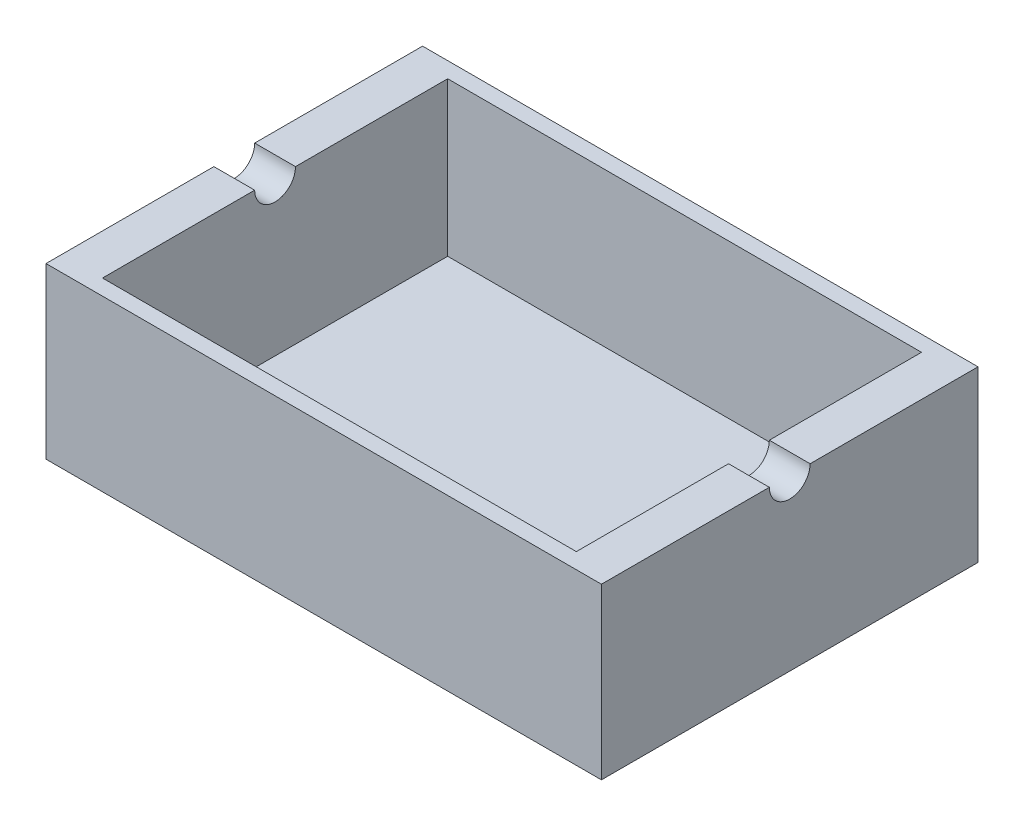
ISO-10303-21;
HEADER;
FILE_DESCRIPTION(('STEP AP214'),'2;1');
FILE_NAME('part.step','',(''),(''),'','','');
FILE_SCHEMA(('AUTOMOTIVE_DESIGN { 1 0 10303 214 1 1 1 1 }'));
ENDSEC;
DATA;
#1=APPLICATION_CONTEXT('core data for automotive mechanical design processes');
#2=APPLICATION_PROTOCOL_DEFINITION('international standard','automotive_design',2000,#1);
#3=PRODUCT_CONTEXT('',#1,'mechanical');
#4=PRODUCT('Part','Part','',(#3));
#5=PRODUCT_RELATED_PRODUCT_CATEGORY('part','',(#4));
#6=PRODUCT_DEFINITION_FORMATION('','',#4);
#7=PRODUCT_DEFINITION_CONTEXT('part definition',#1,'design');
#8=PRODUCT_DEFINITION('design','',#6,#7);
#9=PRODUCT_DEFINITION_SHAPE('','',#8);
#10=(LENGTH_UNIT() NAMED_UNIT(*) SI_UNIT(.MILLI.,.METRE.));
#11=(NAMED_UNIT(*) PLANE_ANGLE_UNIT() SI_UNIT($,.RADIAN.));
#12=(NAMED_UNIT(*) SI_UNIT($,.STERADIAN.) SOLID_ANGLE_UNIT());
#13=UNCERTAINTY_MEASURE_WITH_UNIT(LENGTH_MEASURE(1.E-05),#10,'distance_accuracy_value','');
#14=(GEOMETRIC_REPRESENTATION_CONTEXT(3) GLOBAL_UNCERTAINTY_ASSIGNED_CONTEXT((#13)) GLOBAL_UNIT_ASSIGNED_CONTEXT((#10,
#11,#12)) REPRESENTATION_CONTEXT('',''));
#15=CARTESIAN_POINT('',(0.,0.,0.));
#16=DIRECTION('',(0.,0.,1.));
#17=DIRECTION('',(1.,0.,0.));
#18=AXIS2_PLACEMENT_3D('',#15,#16,#17);
#19=CARTESIAN_POINT('',(0.,19.6,0.));
#20=DIRECTION('',(0.,-1.,0.));
#21=DIRECTION('',(0.,0.,-1.));
#22=AXIS2_PLACEMENT_3D('',#19,#20,#21);
#23=PLANE('',#22);
#24=DIRECTION('',(0.,0.,1.));
#25=VECTOR('',#24,1.);
#26=CARTESIAN_POINT('',(-35.4,19.6,24.));
#27=LINE('',#26,#25);
#28=CARTESIAN_POINT('',(-35.4,19.6,-24.));
#29=VERTEX_POINT('',#28);
#30=CARTESIAN_POINT('',(-35.4,19.6,-2.6));
#31=VERTEX_POINT('',#30);
#32=EDGE_CURVE('E150',#29,#31,#27,.T.);
#33=ORIENTED_EDGE('',*,*,#32,.T.);
#34=DIRECTION('',(1.,0.,0.));
#35=VECTOR('',#34,1.);
#36=CARTESIAN_POINT('',(-41.2137767414995,19.6,-2.6));
#37=LINE('',#36,#35);
#38=CARTESIAN_POINT('',(-30.2,19.6,-2.6));
#39=VERTEX_POINT('',#38);
#40=EDGE_CURVE('E135',#31,#39,#37,.T.);
#41=ORIENTED_EDGE('',*,*,#40,.T.);
#42=DIRECTION('',(0.,0.,1.));
#43=VECTOR('',#42,1.);
#44=CARTESIAN_POINT('',(-30.2,19.6,22.));
#45=LINE('',#44,#43);
#46=CARTESIAN_POINT('',(-30.2,19.6,-22.));
#47=VERTEX_POINT('',#46);
#48=EDGE_CURVE('E190',#47,#39,#45,.T.);
#49=ORIENTED_EDGE('',*,*,#48,.F.);
#50=DIRECTION('',(-1.,0.,0.));
#51=VECTOR('',#50,1.);
#52=CARTESIAN_POINT('',(-30.2,19.6,-22.));
#53=LINE('',#52,#51);
#54=CARTESIAN_POINT('',(30.2,19.6,-22.));
#55=VERTEX_POINT('',#54);
#56=EDGE_CURVE('E187',#55,#47,#53,.T.);
#57=ORIENTED_EDGE('',*,*,#56,.F.);
#58=DIRECTION('',(0.,0.,-1.));
#59=VECTOR('',#58,1.);
#60=CARTESIAN_POINT('',(30.2,19.6,22.));
#61=LINE('',#60,#59);
#62=CARTESIAN_POINT('',(30.2,19.6,-2.6));
#63=VERTEX_POINT('',#62);
#64=EDGE_CURVE('E134',#63,#55,#61,.T.);
#65=ORIENTED_EDGE('',*,*,#64,.F.);
#66=CARTESIAN_POINT('',(35.4,19.6,-2.6));
#67=VERTEX_POINT('',#66);
#68=EDGE_CURVE('E48',#63,#67,#37,.T.);
#69=ORIENTED_EDGE('',*,*,#68,.T.);
#70=DIRECTION('',(0.,0.,-1.));
#71=VECTOR('',#70,1.);
#72=CARTESIAN_POINT('',(35.4,19.6,24.));
#73=LINE('',#72,#71);
#74=CARTESIAN_POINT('',(35.4,19.6,-24.));
#75=VERTEX_POINT('',#74);
#76=EDGE_CURVE('E131',#67,#75,#73,.T.);
#77=ORIENTED_EDGE('',*,*,#76,.T.);
#78=DIRECTION('',(-1.,0.,0.));
#79=VECTOR('',#78,1.);
#80=CARTESIAN_POINT('',(-35.4,19.6,-24.));
#81=LINE('',#80,#79);
#82=EDGE_CURVE('E142',#75,#29,#81,.T.);
#83=ORIENTED_EDGE('',*,*,#82,.T.);
#84=EDGE_LOOP('',(#33,#41,#49,#57,#65,#69,#77,#83));
#85=FACE_BOUND('',#84,.T.);
#86=ADVANCED_FACE('F33',(#85),#23,.F.);
#87=CARTESIAN_POINT('',(35.4,19.6,24.));
#88=VERTEX_POINT('',#87);
#89=CARTESIAN_POINT('',(35.4,19.6,2.6));
#90=VERTEX_POINT('',#89);
#91=EDGE_CURVE('E139',#88,#90,#73,.T.);
#92=ORIENTED_EDGE('',*,*,#91,.T.);
#93=DIRECTION('',(1.,0.,0.));
#94=VECTOR('',#93,1.);
#95=CARTESIAN_POINT('',(-41.2137767414995,19.6,2.6));
#96=LINE('',#95,#94);
#97=CARTESIAN_POINT('',(30.2,19.6,2.6));
#98=VERTEX_POINT('',#97);
#99=EDGE_CURVE('E122',#98,#90,#96,.T.);
#100=ORIENTED_EDGE('',*,*,#99,.F.);
#101=CARTESIAN_POINT('',(30.2,19.6,22.));
#102=VERTEX_POINT('',#101);
#103=EDGE_CURVE('E184',#102,#98,#61,.T.);
#104=ORIENTED_EDGE('',*,*,#103,.F.);
#105=DIRECTION('',(1.,0.,0.));
#106=VECTOR('',#105,1.);
#107=CARTESIAN_POINT('',(-30.2,19.6,22.));
#108=LINE('',#107,#106);
#109=CARTESIAN_POINT('',(-30.2,19.6,22.));
#110=VERTEX_POINT('',#109);
#111=EDGE_CURVE('E193',#110,#102,#108,.T.);
#112=ORIENTED_EDGE('',*,*,#111,.F.);
#113=CARTESIAN_POINT('',(-30.2,19.6,2.6));
#114=VERTEX_POINT('',#113);
#115=EDGE_CURVE('E189',#114,#110,#45,.T.);
#116=ORIENTED_EDGE('',*,*,#115,.F.);
#117=CARTESIAN_POINT('',(-35.4,19.6,2.6));
#118=VERTEX_POINT('',#117);
#119=EDGE_CURVE('E55',#118,#114,#96,.T.);
#120=ORIENTED_EDGE('',*,*,#119,.F.);
#121=CARTESIAN_POINT('',(-35.4,19.6,24.));
#122=VERTEX_POINT('',#121);
#123=EDGE_CURVE('E149',#118,#122,#27,.T.);
#124=ORIENTED_EDGE('',*,*,#123,.T.);
#125=DIRECTION('',(1.,0.,0.));
#126=VECTOR('',#125,1.);
#127=CARTESIAN_POINT('',(-35.4,19.6,24.));
#128=LINE('',#127,#126);
#129=EDGE_CURVE('E152',#122,#88,#128,.T.);
#130=ORIENTED_EDGE('',*,*,#129,.T.);
#131=EDGE_LOOP('',(#92,#100,#104,#112,#116,#120,#124,#130));
#132=FACE_BOUND('',#131,.T.);
#133=ADVANCED_FACE('F231',(#132),#23,.F.);
#134=CARTESIAN_POINT('',(35.4,19.6,24.));
#135=DIRECTION('',(-1.,0.,0.));
#136=DIRECTION('',(0.,0.,1.));
#137=AXIS2_PLACEMENT_3D('',#134,#135,#136);
#138=PLANE('',#137);
#139=ORIENTED_EDGE('',*,*,#76,.F.);
#140=CARTESIAN_POINT('',(35.4,19.6,0.));
#141=DIRECTION('',(1.,0.,0.));
#142=DIRECTION('',(0.,0.,-1.));
#143=AXIS2_PLACEMENT_3D('',#140,#141,#142);
#144=CIRCLE('',#143,2.6);
#145=EDGE_CURVE('E119',#90,#67,#144,.T.);
#146=ORIENTED_EDGE('',*,*,#145,.F.);
#147=ORIENTED_EDGE('',*,*,#91,.F.);
#148=DIRECTION('',(0.,-1.,0.));
#149=VECTOR('',#148,1.);
#150=CARTESIAN_POINT('',(35.4,19.6,24.));
#151=LINE('',#150,#149);
#152=CARTESIAN_POINT('',(35.4,-2.,24.));
#153=VERTEX_POINT('',#152);
#154=EDGE_CURVE('E154',#88,#153,#151,.T.);
#155=ORIENTED_EDGE('',*,*,#154,.T.);
#156=DIRECTION('',(0.,0.,-1.));
#157=VECTOR('',#156,1.);
#158=CARTESIAN_POINT('',(35.4,-2.,0.));
#159=LINE('',#158,#157);
#160=CARTESIAN_POINT('',(35.4,-2.,-24.));
#161=VERTEX_POINT('',#160);
#162=EDGE_CURVE('E170',#153,#161,#159,.T.);
#163=ORIENTED_EDGE('',*,*,#162,.T.);
#164=DIRECTION('',(0.,-1.,0.));
#165=VECTOR('',#164,1.);
#166=CARTESIAN_POINT('',(35.4,19.6,-24.));
#167=LINE('',#166,#165);
#168=EDGE_CURVE('E41',#75,#161,#167,.T.);
#169=ORIENTED_EDGE('',*,*,#168,.F.);
#170=EDGE_LOOP('',(#139,#146,#147,#155,#163,#169));
#171=FACE_BOUND('',#170,.T.);
#172=ADVANCED_FACE('F35',(#171),#138,.F.);
#173=CARTESIAN_POINT('',(-35.4,19.6,-24.));
#174=DIRECTION('',(0.,0.,1.));
#175=DIRECTION('',(1.,0.,0.));
#176=AXIS2_PLACEMENT_3D('',#173,#174,#175);
#177=PLANE('',#176);
#178=ORIENTED_EDGE('',*,*,#168,.T.);
#179=DIRECTION('',(1.,0.,0.));
#180=VECTOR('',#179,1.);
#181=CARTESIAN_POINT('',(0.,-2.,-24.));
#182=LINE('',#181,#180);
#183=CARTESIAN_POINT('',(-35.4,-2.,-24.));
#184=VERTEX_POINT('',#183);
#185=EDGE_CURVE('E164',#184,#161,#182,.T.);
#186=ORIENTED_EDGE('',*,*,#185,.F.);
#187=DIRECTION('',(0.,-1.,0.));
#188=VECTOR('',#187,1.);
#189=CARTESIAN_POINT('',(-35.4,19.6,-24.));
#190=LINE('',#189,#188);
#191=EDGE_CURVE('E158',#29,#184,#190,.T.);
#192=ORIENTED_EDGE('',*,*,#191,.F.);
#193=ORIENTED_EDGE('',*,*,#82,.F.);
#194=EDGE_LOOP('',(#178,#186,#192,#193));
#195=FACE_BOUND('',#194,.T.);
#196=ADVANCED_FACE('F162',(#195),#177,.F.);
#197=CARTESIAN_POINT('',(-35.4,19.6,24.));
#198=DIRECTION('',(1.,0.,0.));
#199=DIRECTION('',(0.,0.,-1.));
#200=AXIS2_PLACEMENT_3D('',#197,#198,#199);
#201=PLANE('',#200);
#202=ORIENTED_EDGE('',*,*,#123,.F.);
#203=CARTESIAN_POINT('',(-35.4,19.6,0.));
#204=DIRECTION('',(1.,0.,0.));
#205=DIRECTION('',(0.,0.,-1.));
#206=AXIS2_PLACEMENT_3D('',#203,#204,#205);
#207=CIRCLE('',#206,2.6);
#208=EDGE_CURVE('E232',#31,#118,#207,.F.);
#209=ORIENTED_EDGE('',*,*,#208,.F.);
#210=ORIENTED_EDGE('',*,*,#32,.F.);
#211=ORIENTED_EDGE('',*,*,#191,.T.);
#212=DIRECTION('',(0.,0.,-1.));
#213=VECTOR('',#212,1.);
#214=CARTESIAN_POINT('',(-35.4,-2.,0.));
#215=LINE('',#214,#213);
#216=CARTESIAN_POINT('',(-35.4,-2.,24.));
#217=VERTEX_POINT('',#216);
#218=EDGE_CURVE('E173',#217,#184,#215,.T.);
#219=ORIENTED_EDGE('',*,*,#218,.F.);
#220=DIRECTION('',(0.,-1.,0.));
#221=VECTOR('',#220,1.);
#222=CARTESIAN_POINT('',(-35.4,19.6,24.));
#223=LINE('',#222,#221);
#224=EDGE_CURVE('E156',#122,#217,#223,.T.);
#225=ORIENTED_EDGE('',*,*,#224,.F.);
#226=EDGE_LOOP('',(#202,#209,#210,#211,#219,#225));
#227=FACE_BOUND('',#226,.T.);
#228=ADVANCED_FACE('F257',(#227),#201,.F.);
#229=CARTESIAN_POINT('',(-35.4,19.6,24.));
#230=DIRECTION('',(0.,0.,-1.));
#231=DIRECTION('',(-1.,0.,0.));
#232=AXIS2_PLACEMENT_3D('',#229,#230,#231);
#233=PLANE('',#232);
#234=ORIENTED_EDGE('',*,*,#224,.T.);
#235=DIRECTION('',(1.,0.,0.));
#236=VECTOR('',#235,1.);
#237=CARTESIAN_POINT('',(0.,-2.,24.));
#238=LINE('',#237,#236);
#239=EDGE_CURVE('E176',#217,#153,#238,.T.);
#240=ORIENTED_EDGE('',*,*,#239,.T.);
#241=ORIENTED_EDGE('',*,*,#154,.F.);
#242=ORIENTED_EDGE('',*,*,#129,.F.);
#243=EDGE_LOOP('',(#234,#240,#241,#242));
#244=FACE_BOUND('',#243,.T.);
#245=ADVANCED_FACE('F254',(#244),#233,.F.);
#246=CARTESIAN_POINT('',(30.2,19.6,22.));
#247=DIRECTION('',(-1.,0.,0.));
#248=DIRECTION('',(0.,0.,1.));
#249=AXIS2_PLACEMENT_3D('',#246,#247,#248);
#250=PLANE('',#249);
#251=CARTESIAN_POINT('',(30.2,19.6,0.));
#252=DIRECTION('',(-1.,0.,0.));
#253=DIRECTION('',(0.,0.,1.));
#254=AXIS2_PLACEMENT_3D('',#251,#252,#253);
#255=CIRCLE('',#254,2.6);
#256=EDGE_CURVE('E178',#63,#98,#255,.T.);
#257=ORIENTED_EDGE('',*,*,#256,.F.);
#258=ORIENTED_EDGE('',*,*,#64,.T.);
#259=DIRECTION('',(0.,-1.,0.));
#260=VECTOR('',#259,1.);
#261=CARTESIAN_POINT('',(30.2,19.6,-22.));
#262=LINE('',#261,#260);
#263=CARTESIAN_POINT('',(30.2,0.,-22.));
#264=VERTEX_POINT('',#263);
#265=EDGE_CURVE('E140',#55,#264,#262,.T.);
#266=ORIENTED_EDGE('',*,*,#265,.T.);
#267=DIRECTION('',(0.,0.,-1.));
#268=VECTOR('',#267,1.);
#269=CARTESIAN_POINT('',(30.2,0.,22.));
#270=LINE('',#269,#268);
#271=CARTESIAN_POINT('',(30.2,0.,22.));
#272=VERTEX_POINT('',#271);
#273=EDGE_CURVE('E183',#272,#264,#270,.T.);
#274=ORIENTED_EDGE('',*,*,#273,.F.);
#275=DIRECTION('',(0.,-1.,0.));
#276=VECTOR('',#275,1.);
#277=CARTESIAN_POINT('',(30.2,19.6,22.));
#278=LINE('',#277,#276);
#279=EDGE_CURVE('E195',#102,#272,#278,.T.);
#280=ORIENTED_EDGE('',*,*,#279,.F.);
#281=ORIENTED_EDGE('',*,*,#103,.T.);
#282=EDGE_LOOP('',(#257,#258,#266,#274,#280,#281));
#283=FACE_BOUND('',#282,.T.);
#284=ADVANCED_FACE('F224',(#283),#250,.T.);
#285=CARTESIAN_POINT('',(-30.2,19.6,-22.));
#286=DIRECTION('',(0.,0.,1.));
#287=DIRECTION('',(1.,0.,0.));
#288=AXIS2_PLACEMENT_3D('',#285,#286,#287);
#289=PLANE('',#288);
#290=DIRECTION('',(-1.,0.,0.));
#291=VECTOR('',#290,1.);
#292=CARTESIAN_POINT('',(-30.2,0.,-22.));
#293=LINE('',#292,#291);
#294=CARTESIAN_POINT('',(-30.2,0.,-22.));
#295=VERTEX_POINT('',#294);
#296=EDGE_CURVE('E198',#264,#295,#293,.T.);
#297=ORIENTED_EDGE('',*,*,#296,.F.);
#298=ORIENTED_EDGE('',*,*,#265,.F.);
#299=ORIENTED_EDGE('',*,*,#56,.T.);
#300=DIRECTION('',(0.,-1.,0.));
#301=VECTOR('',#300,1.);
#302=CARTESIAN_POINT('',(-30.2,19.6,-22.));
#303=LINE('',#302,#301);
#304=EDGE_CURVE('E144',#47,#295,#303,.T.);
#305=ORIENTED_EDGE('',*,*,#304,.T.);
#306=EDGE_LOOP('',(#297,#298,#299,#305));
#307=FACE_BOUND('',#306,.T.);
#308=ADVANCED_FACE('F214',(#307),#289,.T.);
#309=CARTESIAN_POINT('',(-30.2,19.6,22.));
#310=DIRECTION('',(1.,0.,0.));
#311=DIRECTION('',(0.,0.,-1.));
#312=AXIS2_PLACEMENT_3D('',#309,#310,#311);
#313=PLANE('',#312);
#314=CARTESIAN_POINT('',(-30.2,19.6,0.));
#315=DIRECTION('',(1.,0.,0.));
#316=DIRECTION('',(0.,0.,-1.));
#317=AXIS2_PLACEMENT_3D('',#314,#315,#316);
#318=CIRCLE('',#317,2.6);
#319=EDGE_CURVE('E11',#114,#39,#318,.T.);
#320=ORIENTED_EDGE('',*,*,#319,.F.);
#321=ORIENTED_EDGE('',*,*,#115,.T.);
#322=DIRECTION('',(0.,-1.,0.));
#323=VECTOR('',#322,1.);
#324=CARTESIAN_POINT('',(-30.2,19.6,22.));
#325=LINE('',#324,#323);
#326=CARTESIAN_POINT('',(-30.2,0.,22.));
#327=VERTEX_POINT('',#326);
#328=EDGE_CURVE('E209',#110,#327,#325,.T.);
#329=ORIENTED_EDGE('',*,*,#328,.T.);
#330=DIRECTION('',(0.,0.,1.));
#331=VECTOR('',#330,1.);
#332=CARTESIAN_POINT('',(-30.2,0.,22.));
#333=LINE('',#332,#331);
#334=EDGE_CURVE('E201',#295,#327,#333,.T.);
#335=ORIENTED_EDGE('',*,*,#334,.F.);
#336=ORIENTED_EDGE('',*,*,#304,.F.);
#337=ORIENTED_EDGE('',*,*,#48,.T.);
#338=EDGE_LOOP('',(#320,#321,#329,#335,#336,#337));
#339=FACE_BOUND('',#338,.T.);
#340=ADVANCED_FACE('F218',(#339),#313,.T.);
#341=CARTESIAN_POINT('',(-30.2,19.6,22.));
#342=DIRECTION('',(0.,0.,-1.));
#343=DIRECTION('',(-1.,0.,0.));
#344=AXIS2_PLACEMENT_3D('',#341,#342,#343);
#345=PLANE('',#344);
#346=DIRECTION('',(1.,0.,0.));
#347=VECTOR('',#346,1.);
#348=CARTESIAN_POINT('',(-30.2,0.,22.));
#349=LINE('',#348,#347);
#350=EDGE_CURVE('E204',#327,#272,#349,.T.);
#351=ORIENTED_EDGE('',*,*,#350,.F.);
#352=ORIENTED_EDGE('',*,*,#328,.F.);
#353=ORIENTED_EDGE('',*,*,#111,.T.);
#354=ORIENTED_EDGE('',*,*,#279,.T.);
#355=EDGE_LOOP('',(#351,#352,#353,#354));
#356=FACE_BOUND('',#355,.T.);
#357=ADVANCED_FACE('F227',(#356),#345,.T.);
#358=CARTESIAN_POINT('',(0.,0.,0.));
#359=DIRECTION('',(0.,1.,0.));
#360=DIRECTION('',(0.,0.,1.));
#361=AXIS2_PLACEMENT_3D('',#358,#359,#360);
#362=PLANE('',#361);
#363=ORIENTED_EDGE('',*,*,#334,.T.);
#364=ORIENTED_EDGE('',*,*,#350,.T.);
#365=ORIENTED_EDGE('',*,*,#273,.T.);
#366=ORIENTED_EDGE('',*,*,#296,.T.);
#367=EDGE_LOOP('',(#363,#364,#365,#366));
#368=FACE_BOUND('',#367,.T.);
#369=ADVANCED_FACE('F221',(#368),#362,.T.);
#370=CARTESIAN_POINT('',(0.,-2.,0.));
#371=DIRECTION('',(0.,1.,0.));
#372=DIRECTION('',(0.,0.,1.));
#373=AXIS2_PLACEMENT_3D('',#370,#371,#372);
#374=PLANE('',#373);
#375=ORIENTED_EDGE('',*,*,#239,.F.);
#376=ORIENTED_EDGE('',*,*,#218,.T.);
#377=ORIENTED_EDGE('',*,*,#185,.T.);
#378=ORIENTED_EDGE('',*,*,#162,.F.);
#379=EDGE_LOOP('',(#375,#376,#377,#378));
#380=FACE_BOUND('',#379,.T.);
#381=ADVANCED_FACE('F169',(#380),#374,.F.);
#382=CARTESIAN_POINT('',(-41.2137767414995,19.6,0.));
#383=DIRECTION('',(1.,0.,0.));
#384=DIRECTION('',(0.,0.,-1.));
#385=AXIS2_PLACEMENT_3D('',#382,#383,#384);
#386=CYLINDRICAL_SURFACE('',#385,2.6);
#387=ORIENTED_EDGE('',*,*,#319,.T.);
#388=ORIENTED_EDGE('',*,*,#40,.F.);
#389=ORIENTED_EDGE('',*,*,#208,.T.);
#390=ORIENTED_EDGE('',*,*,#119,.T.);
#391=EDGE_LOOP('',(#387,#388,#389,#390));
#392=FACE_BOUND('',#391,.T.);
#393=ADVANCED_FACE('F238',(#392),#386,.F.);
#394=ORIENTED_EDGE('',*,*,#256,.T.);
#395=ORIENTED_EDGE('',*,*,#99,.T.);
#396=ORIENTED_EDGE('',*,*,#145,.T.);
#397=ORIENTED_EDGE('',*,*,#68,.F.);
#398=EDGE_LOOP('',(#394,#395,#396,#397));
#399=FACE_BOUND('',#398,.T.);
#400=ADVANCED_FACE('F120',(#399),#386,.F.);
#401=CLOSED_SHELL('',(#86,#133,#172,#196,#228,#245,#284,#308,#340,#357,#369,#381,#393,#400));
#402=MANIFOLD_SOLID_BREP('B2',#401);
#403=ADVANCED_BREP_SHAPE_REPRESENTATION('',(#18,#402),#14);
#404=SHAPE_DEFINITION_REPRESENTATION(#9,#403);
ENDSEC;
END-ISO-10303-21;
